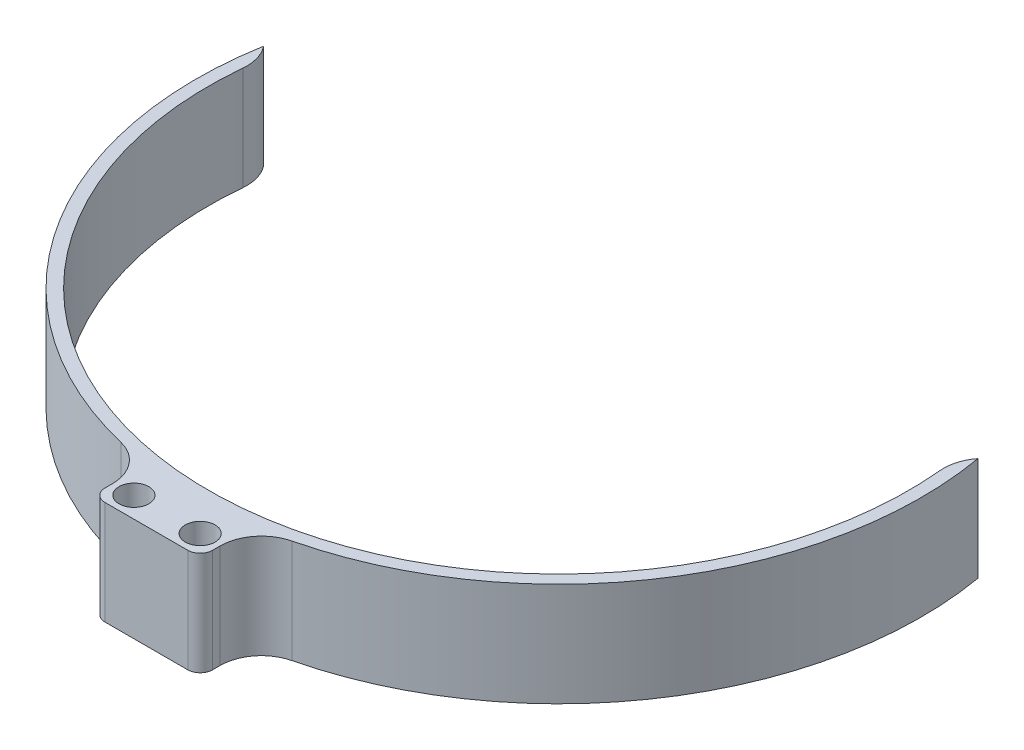
ISO-10303-21;
HEADER;
FILE_DESCRIPTION(('STEP AP214'),'2;1');
FILE_NAME('part.step','',(''),(''),'','','');
FILE_SCHEMA(('AUTOMOTIVE_DESIGN { 1 0 10303 214 1 1 1 1 }'));
ENDSEC;
DATA;
#1=APPLICATION_CONTEXT('core data for automotive mechanical design processes');
#2=APPLICATION_PROTOCOL_DEFINITION('international standard','automotive_design',2000,#1);
#3=PRODUCT_CONTEXT('',#1,'mechanical');
#4=PRODUCT('Part','Part','',(#3));
#5=PRODUCT_RELATED_PRODUCT_CATEGORY('part','',(#4));
#6=PRODUCT_DEFINITION_FORMATION('','',#4);
#7=PRODUCT_DEFINITION_CONTEXT('part definition',#1,'design');
#8=PRODUCT_DEFINITION('design','',#6,#7);
#9=PRODUCT_DEFINITION_SHAPE('','',#8);
#10=(LENGTH_UNIT() NAMED_UNIT(*) SI_UNIT(.MILLI.,.METRE.));
#11=(NAMED_UNIT(*) PLANE_ANGLE_UNIT() SI_UNIT($,.RADIAN.));
#12=(NAMED_UNIT(*) SI_UNIT($,.STERADIAN.) SOLID_ANGLE_UNIT());
#13=UNCERTAINTY_MEASURE_WITH_UNIT(LENGTH_MEASURE(1.E-05),#10,'distance_accuracy_value','');
#14=(GEOMETRIC_REPRESENTATION_CONTEXT(3) GLOBAL_UNCERTAINTY_ASSIGNED_CONTEXT((#13)) GLOBAL_UNIT_ASSIGNED_CONTEXT((#10,
#11,#12)) REPRESENTATION_CONTEXT('',''));
#15=CARTESIAN_POINT('',(0.,0.,0.));
#16=DIRECTION('',(0.,0.,1.));
#17=DIRECTION('',(1.,0.,0.));
#18=AXIS2_PLACEMENT_3D('',#15,#16,#17);
#19=CARTESIAN_POINT('',(0.,5.,0.));
#20=DIRECTION('',(0.,1.,0.));
#21=DIRECTION('',(0.,0.,1.));
#22=AXIS2_PLACEMENT_3D('',#19,#20,#21);
#23=PLANE('',#22);
#24=CARTESIAN_POINT('',(-8.,5.,94.5288969073338));
#25=DIRECTION('',(0.,1.,0.));
#26=DIRECTION('',(0.,0.,1.));
#27=AXIS2_PLACEMENT_3D('',#24,#25,#26);
#28=CIRCLE('',#27,2.3);
#29=CARTESIAN_POINT('',(-8.,5.,96.8288969073338));
#30=VERTEX_POINT('',#29);
#31=EDGE_CURVE('E241',#30,#30,#28,.T.);
#32=ORIENTED_EDGE('',*,*,#31,.F.);
#33=EDGE_LOOP('',(#32));
#34=FACE_BOUND('',#33,.T.);
#35=CARTESIAN_POINT('',(-8.,5.,94.5288969073338));
#36=DIRECTION('',(0.,1.,0.));
#37=DIRECTION('',(0.,0.,1.));
#38=AXIS2_PLACEMENT_3D('',#35,#36,#37);
#39=CIRCLE('',#38,3.6);
#40=CARTESIAN_POINT('',(-8.,5.,98.1288969073338));
#41=VERTEX_POINT('',#40);
#42=EDGE_CURVE('E255',#41,#41,#39,.F.);
#43=ORIENTED_EDGE('',*,*,#42,.F.);
#44=EDGE_LOOP('',(#43));
#45=FACE_BOUND('',#44,.T.);
#46=ADVANCED_FACE('F123',(#34,#45),#23,.T.);
#47=CARTESIAN_POINT('',(8.,5.,94.5288969073338));
#48=DIRECTION('',(0.,1.,0.));
#49=DIRECTION('',(0.,0.,1.));
#50=AXIS2_PLACEMENT_3D('',#47,#48,#49);
#51=CIRCLE('',#50,2.3);
#52=CARTESIAN_POINT('',(8.,5.,96.8288969073338));
#53=VERTEX_POINT('',#52);
#54=EDGE_CURVE('E247',#53,#53,#51,.F.);
#55=ORIENTED_EDGE('',*,*,#54,.T.);
#56=EDGE_LOOP('',(#55));
#57=FACE_BOUND('',#56,.T.);
#58=CARTESIAN_POINT('',(8.,5.,94.5288969073338));
#59=DIRECTION('',(0.,1.,0.));
#60=DIRECTION('',(0.,0.,1.));
#61=AXIS2_PLACEMENT_3D('',#58,#59,#60);
#62=CIRCLE('',#61,3.6);
#63=CARTESIAN_POINT('',(8.,5.,98.1288969073338));
#64=VERTEX_POINT('',#63);
#65=EDGE_CURVE('E244',#64,#64,#62,.F.);
#66=ORIENTED_EDGE('',*,*,#65,.F.);
#67=EDGE_LOOP('',(#66));
#68=FACE_BOUND('',#67,.T.);
#69=ADVANCED_FACE('F365',(#57,#68),#23,.T.);
#70=CARTESIAN_POINT('',(13.,5.,0.));
#71=DIRECTION('',(1.,0.,0.));
#72=DIRECTION('',(0.,0.,-1.));
#73=AXIS2_PLACEMENT_3D('',#70,#71,#72);
#74=PLANE('',#73);
#75=DIRECTION('',(0.,0.,-1.));
#76=VECTOR('',#75,1.);
#77=CARTESIAN_POINT('',(13.,25.,0.));
#78=LINE('',#77,#76);
#79=CARTESIAN_POINT('',(13.,25.,96.5288969073338));
#80=VERTEX_POINT('',#79);
#81=CARTESIAN_POINT('',(13.,25.,94.7483509091319));
#82=VERTEX_POINT('',#81);
#83=EDGE_CURVE('E298',#80,#82,#78,.T.);
#84=ORIENTED_EDGE('',*,*,#83,.F.);
#85=DIRECTION('',(0.,-1.,0.));
#86=VECTOR('',#85,1.);
#87=CARTESIAN_POINT('',(13.,0.,96.5288969073338));
#88=LINE('',#87,#86);
#89=CARTESIAN_POINT('',(13.,0.,96.5288969073338));
#90=VERTEX_POINT('',#89);
#91=EDGE_CURVE('E284',#80,#90,#88,.T.);
#92=ORIENTED_EDGE('',*,*,#91,.T.);
#93=DIRECTION('',(0.,0.,1.));
#94=VECTOR('',#93,1.);
#95=CARTESIAN_POINT('',(13.,0.,0.));
#96=LINE('',#95,#94);
#97=CARTESIAN_POINT('',(13.,0.,94.7483509091319));
#98=VERTEX_POINT('',#97);
#99=EDGE_CURVE('E318',#98,#90,#96,.T.);
#100=ORIENTED_EDGE('',*,*,#99,.F.);
#101=DIRECTION('',(0.,-1.,0.));
#102=VECTOR('',#101,1.);
#103=CARTESIAN_POINT('',(13.,5.,94.7483509091319));
#104=LINE('',#103,#102);
#105=EDGE_CURVE('E261',#98,#82,#104,.F.);
#106=ORIENTED_EDGE('',*,*,#105,.T.);
#107=EDGE_LOOP('',(#84,#92,#100,#106));
#108=FACE_BOUND('',#107,.T.);
#109=ADVANCED_FACE('F304',(#108),#74,.T.);
#110=CARTESIAN_POINT('',(0.,5.,0.));
#111=DIRECTION('',(0.,-1.,0.));
#112=DIRECTION('',(0.,0.,-1.));
#113=AXIS2_PLACEMENT_3D('',#110,#111,#112);
#114=CYLINDRICAL_SURFACE('',#113,87.5);
#115=CARTESIAN_POINT('',(0.,25.,0.));
#116=DIRECTION('',(0.,1.,0.));
#117=DIRECTION('',(0.,0.,1.));
#118=AXIS2_PLACEMENT_3D('',#115,#116,#117);
#119=CIRCLE('',#118,87.5);
#120=CARTESIAN_POINT('',(20.6410256410256,25.,85.0305713287081));
#121=VERTEX_POINT('',#120);
#122=CARTESIAN_POINT('',(86.2046982478333,25.,-15.));
#123=VERTEX_POINT('',#122);
#124=EDGE_CURVE('E309',#121,#123,#119,.T.);
#125=ORIENTED_EDGE('',*,*,#124,.F.);
#126=DIRECTION('',(0.,-1.,0.));
#127=VECTOR('',#126,1.);
#128=CARTESIAN_POINT('',(20.6410256410257,5.,85.0305713287081));
#129=LINE('',#128,#127);
#130=CARTESIAN_POINT('',(20.6410256410256,0.,85.0305713287081));
#131=VERTEX_POINT('',#130);
#132=EDGE_CURVE('E258',#121,#131,#129,.T.);
#133=ORIENTED_EDGE('',*,*,#132,.T.);
#134=CARTESIAN_POINT('',(0.,0.,0.));
#135=DIRECTION('',(0.,1.,0.));
#136=DIRECTION('',(0.,0.,1.));
#137=AXIS2_PLACEMENT_3D('',#134,#135,#136);
#138=CIRCLE('',#137,87.5);
#139=CARTESIAN_POINT('',(86.2046982478333,0.,-15.));
#140=VERTEX_POINT('',#139);
#141=EDGE_CURVE('E332',#131,#140,#138,.T.);
#142=ORIENTED_EDGE('',*,*,#141,.T.);
#143=DIRECTION('',(0.,-1.,0.));
#144=VECTOR('',#143,1.);
#145=CARTESIAN_POINT('',(86.2046982478333,5.,-15.));
#146=LINE('',#145,#144);
#147=EDGE_CURVE('E240',#123,#140,#146,.T.);
#148=ORIENTED_EDGE('',*,*,#147,.F.);
#149=EDGE_LOOP('',(#125,#133,#142,#148));
#150=FACE_BOUND('',#149,.T.);
#151=ADVANCED_FACE('F389',(#150),#114,.T.);
#152=CARTESIAN_POINT('',(0.,5.,0.));
#153=DIRECTION('',(0.,-1.,0.));
#154=DIRECTION('',(0.,0.,-1.));
#155=AXIS2_PLACEMENT_3D('',#152,#153,#154);
#156=CYLINDRICAL_SURFACE('',#155,84.5);
#157=CARTESIAN_POINT('',(0.,0.,0.));
#158=DIRECTION('',(0.,1.,0.));
#159=DIRECTION('',(0.,0.,1.));
#160=AXIS2_PLACEMENT_3D('',#157,#158,#159);
#161=CIRCLE('',#160,84.5);
#162=CARTESIAN_POINT('',(-84.129139790498,0.,-7.90808688058305));
#163=VERTEX_POINT('',#162);
#164=CARTESIAN_POINT('',(84.129139790498,0.,-7.90808688058308));
#165=VERTEX_POINT('',#164);
#166=EDGE_CURVE('E329',#163,#165,#161,.T.);
#167=ORIENTED_EDGE('',*,*,#166,.F.);
#168=DIRECTION('',(0.,-1.,0.));
#169=VECTOR('',#168,1.);
#170=CARTESIAN_POINT('',(-84.129139790498,5.,-7.90808688058305));
#171=LINE('',#170,#169);
#172=CARTESIAN_POINT('',(-84.129139790498,25.,-7.90808688058305));
#173=VERTEX_POINT('',#172);
#174=EDGE_CURVE('E274',#163,#173,#171,.F.);
#175=ORIENTED_EDGE('',*,*,#174,.T.);
#176=CARTESIAN_POINT('',(0.,25.,0.));
#177=DIRECTION('',(0.,1.,0.));
#178=DIRECTION('',(0.,0.,1.));
#179=AXIS2_PLACEMENT_3D('',#176,#177,#178);
#180=CIRCLE('',#179,84.5);
#181=CARTESIAN_POINT('',(84.129139790498,25.,-7.90808688058308));
#182=VERTEX_POINT('',#181);
#183=EDGE_CURVE('E220',#173,#182,#180,.T.);
#184=ORIENTED_EDGE('',*,*,#183,.T.);
#185=DIRECTION('',(0.,-1.,0.));
#186=VECTOR('',#185,1.);
#187=CARTESIAN_POINT('',(84.129139790498,5.,-7.90808688058308));
#188=LINE('',#187,#186);
#189=EDGE_CURVE('E271',#182,#165,#188,.T.);
#190=ORIENTED_EDGE('',*,*,#189,.T.);
#191=EDGE_LOOP('',(#167,#175,#184,#190));
#192=FACE_BOUND('',#191,.T.);
#193=ADVANCED_FACE('F388',(#192),#156,.F.);
#194=CARTESIAN_POINT('',(-86.2046982478333,0.,-15.));
#195=VERTEX_POINT('',#194);
#196=CARTESIAN_POINT('',(-20.6410256410256,0.,85.0305713287081));
#197=VERTEX_POINT('',#196);
#198=EDGE_CURVE('E326',#195,#197,#138,.T.);
#199=ORIENTED_EDGE('',*,*,#198,.T.);
#200=DIRECTION('',(0.,-1.,0.));
#201=VECTOR('',#200,1.);
#202=CARTESIAN_POINT('',(-20.6410256410257,5.,85.0305713287081));
#203=LINE('',#202,#201);
#204=CARTESIAN_POINT('',(-20.6410256410256,25.,85.0305713287081));
#205=VERTEX_POINT('',#204);
#206=EDGE_CURVE('E234',#197,#205,#203,.F.);
#207=ORIENTED_EDGE('',*,*,#206,.T.);
#208=CARTESIAN_POINT('',(0.,25.,0.));
#209=DIRECTION('',(0.,1.,0.));
#210=DIRECTION('',(0.,0.,1.));
#211=AXIS2_PLACEMENT_3D('',#208,#209,#210);
#212=CIRCLE('',#211,87.5);
#213=CARTESIAN_POINT('',(-86.2046982478333,25.,-15.));
#214=VERTEX_POINT('',#213);
#215=EDGE_CURVE('E217',#214,#205,#212,.T.);
#216=ORIENTED_EDGE('',*,*,#215,.F.);
#217=DIRECTION('',(0.,-1.,0.));
#218=VECTOR('',#217,1.);
#219=CARTESIAN_POINT('',(-86.2046982478333,5.,-15.));
#220=LINE('',#219,#218);
#221=EDGE_CURVE('E231',#214,#195,#220,.T.);
#222=ORIENTED_EDGE('',*,*,#221,.T.);
#223=EDGE_LOOP('',(#199,#207,#216,#222));
#224=FACE_BOUND('',#223,.T.);
#225=ADVANCED_FACE('F230',(#224),#114,.T.);
#226=CARTESIAN_POINT('',(-13.,5.,0.));
#227=DIRECTION('',(1.,0.,0.));
#228=DIRECTION('',(0.,0.,-1.));
#229=AXIS2_PLACEMENT_3D('',#226,#227,#228);
#230=PLANE('',#229);
#231=DIRECTION('',(0.,0.,1.));
#232=VECTOR('',#231,1.);
#233=CARTESIAN_POINT('',(-13.,0.,0.));
#234=LINE('',#233,#232);
#235=CARTESIAN_POINT('',(-13.,0.,94.7483509091319));
#236=VERTEX_POINT('',#235);
#237=CARTESIAN_POINT('',(-13.,0.,96.5288969073338));
#238=VERTEX_POINT('',#237);
#239=EDGE_CURVE('E323',#236,#238,#234,.T.);
#240=ORIENTED_EDGE('',*,*,#239,.T.);
#241=DIRECTION('',(0.,-1.,0.));
#242=VECTOR('',#241,1.);
#243=CARTESIAN_POINT('',(-13.,5.,96.5288969073338));
#244=LINE('',#243,#242);
#245=CARTESIAN_POINT('',(-13.,25.,96.5288969073338));
#246=VERTEX_POINT('',#245);
#247=EDGE_CURVE('E12',#238,#246,#244,.F.);
#248=ORIENTED_EDGE('',*,*,#247,.T.);
#249=DIRECTION('',(0.,0.,-1.));
#250=VECTOR('',#249,1.);
#251=CARTESIAN_POINT('',(-13.,25.,0.));
#252=LINE('',#251,#250);
#253=CARTESIAN_POINT('',(-13.,25.,94.7483509091319));
#254=VERTEX_POINT('',#253);
#255=EDGE_CURVE('E235',#246,#254,#252,.T.);
#256=ORIENTED_EDGE('',*,*,#255,.T.);
#257=DIRECTION('',(0.,1.,0.));
#258=VECTOR('',#257,1.);
#259=CARTESIAN_POINT('',(-13.,0.,94.7483509091319));
#260=LINE('',#259,#258);
#261=EDGE_CURVE('E264',#254,#236,#260,.F.);
#262=ORIENTED_EDGE('',*,*,#261,.T.);
#263=EDGE_LOOP('',(#240,#248,#256,#262));
#264=FACE_BOUND('',#263,.T.);
#265=ADVANCED_FACE('F380',(#264),#230,.F.);
#266=CARTESIAN_POINT('',(8.,5.,94.5288969073338));
#267=DIRECTION('',(0.,-1.,0.));
#268=DIRECTION('',(0.,0.,-1.));
#269=AXIS2_PLACEMENT_3D('',#266,#267,#268);
#270=CYLINDRICAL_SURFACE('',#269,2.3);
#271=ORIENTED_EDGE('',*,*,#54,.F.);
#272=EDGE_LOOP('',(#271));
#273=FACE_BOUND('',#272,.T.);
#274=CARTESIAN_POINT('',(8.,0.,94.5288969073338));
#275=DIRECTION('',(0.,1.,0.));
#276=DIRECTION('',(0.,0.,1.));
#277=AXIS2_PLACEMENT_3D('',#274,#275,#276);
#278=CIRCLE('',#277,2.3);
#279=CARTESIAN_POINT('',(8.,0.,96.8288969073338));
#280=VERTEX_POINT('',#279);
#281=EDGE_CURVE('E322',#280,#280,#278,.F.);
#282=ORIENTED_EDGE('',*,*,#281,.T.);
#283=EDGE_LOOP('',(#282));
#284=FACE_BOUND('',#283,.T.);
#285=ADVANCED_FACE('F377',(#273,#284),#270,.F.);
#286=CARTESIAN_POINT('',(0.,5.,99.5288969073338));
#287=DIRECTION('',(0.,0.,-1.));
#288=DIRECTION('',(-1.,0.,0.));
#289=AXIS2_PLACEMENT_3D('',#286,#287,#288);
#290=PLANE('',#289);
#291=DIRECTION('',(1.,0.,0.));
#292=VECTOR('',#291,1.);
#293=CARTESIAN_POINT('',(0.,0.,99.5288969073338));
#294=LINE('',#293,#292);
#295=CARTESIAN_POINT('',(-10.,0.,99.5288969073338));
#296=VERTEX_POINT('',#295);
#297=CARTESIAN_POINT('',(10.,0.,99.5288969073338));
#298=VERTEX_POINT('',#297);
#299=EDGE_CURVE('E317',#296,#298,#294,.T.);
#300=ORIENTED_EDGE('',*,*,#299,.T.);
#301=DIRECTION('',(0.,-1.,0.));
#302=VECTOR('',#301,1.);
#303=CARTESIAN_POINT('',(10.,25.,99.5288969073338));
#304=LINE('',#303,#302);
#305=CARTESIAN_POINT('',(10.,25.,99.5288969073338));
#306=VERTEX_POINT('',#305);
#307=EDGE_CURVE('E294',#298,#306,#304,.F.);
#308=ORIENTED_EDGE('',*,*,#307,.T.);
#309=DIRECTION('',(-1.,0.,0.));
#310=VECTOR('',#309,1.);
#311=CARTESIAN_POINT('',(0.,25.,99.5288969073338));
#312=LINE('',#311,#310);
#313=CARTESIAN_POINT('',(-10.,25.,99.5288969073338));
#314=VERTEX_POINT('',#313);
#315=EDGE_CURVE('E299',#306,#314,#312,.T.);
#316=ORIENTED_EDGE('',*,*,#315,.T.);
#317=DIRECTION('',(0.,-1.,0.));
#318=VECTOR('',#317,1.);
#319=CARTESIAN_POINT('',(-10.,5.,99.5288969073338));
#320=LINE('',#319,#318);
#321=EDGE_CURVE('E291',#314,#296,#320,.T.);
#322=ORIENTED_EDGE('',*,*,#321,.T.);
#323=EDGE_LOOP('',(#300,#308,#316,#322));
#324=FACE_BOUND('',#323,.T.);
#325=ADVANCED_FACE('F320',(#324),#290,.F.);
#326=CARTESIAN_POINT('',(-8.,5.,94.5288969073338));
#327=DIRECTION('',(0.,-1.,0.));
#328=DIRECTION('',(0.,0.,-1.));
#329=AXIS2_PLACEMENT_3D('',#326,#327,#328);
#330=CYLINDRICAL_SURFACE('',#329,2.3);
#331=ORIENTED_EDGE('',*,*,#31,.T.);
#332=EDGE_LOOP('',(#331));
#333=FACE_BOUND('',#332,.T.);
#334=CARTESIAN_POINT('',(-8.,0.,94.5288969073338));
#335=DIRECTION('',(0.,1.,0.));
#336=DIRECTION('',(0.,0.,1.));
#337=AXIS2_PLACEMENT_3D('',#334,#335,#336);
#338=CIRCLE('',#337,2.3);
#339=CARTESIAN_POINT('',(-8.,0.,96.8288969073338));
#340=VERTEX_POINT('',#339);
#341=EDGE_CURVE('E250',#340,#340,#338,.T.);
#342=ORIENTED_EDGE('',*,*,#341,.F.);
#343=EDGE_LOOP('',(#342));
#344=FACE_BOUND('',#343,.T.);
#345=ADVANCED_FACE('F360',(#333,#344),#330,.F.);
#346=CARTESIAN_POINT('',(0.,0.,0.));
#347=DIRECTION('',(0.,1.,0.));
#348=DIRECTION('',(0.,0.,1.));
#349=AXIS2_PLACEMENT_3D('',#346,#347,#348);
#350=PLANE('',#349);
#351=ORIENTED_EDGE('',*,*,#99,.T.);
#352=CARTESIAN_POINT('',(10.,0.,96.5288969073338));
#353=DIRECTION('',(0.,1.,0.));
#354=DIRECTION('',(0.,0.,1.));
#355=AXIS2_PLACEMENT_3D('',#352,#353,#354);
#356=CIRCLE('',#355,3.);
#357=EDGE_CURVE('E289',#90,#298,#356,.F.);
#358=ORIENTED_EDGE('',*,*,#357,.T.);
#359=ORIENTED_EDGE('',*,*,#299,.F.);
#360=CARTESIAN_POINT('',(-10.,0.,96.5288969073338));
#361=DIRECTION('',(0.,1.,0.));
#362=DIRECTION('',(0.,0.,1.));
#363=AXIS2_PLACEMENT_3D('',#360,#361,#362);
#364=CIRCLE('',#363,3.);
#365=EDGE_CURVE('E287',#296,#238,#364,.F.);
#366=ORIENTED_EDGE('',*,*,#365,.T.);
#367=ORIENTED_EDGE('',*,*,#239,.F.);
#368=CARTESIAN_POINT('',(-23.,0.,94.7483509091319));
#369=DIRECTION('',(0.,1.,0.));
#370=DIRECTION('',(0.,0.,1.));
#371=AXIS2_PLACEMENT_3D('',#368,#369,#370);
#372=CIRCLE('',#371,10.);
#373=EDGE_CURVE('E280',#236,#197,#372,.T.);
#374=ORIENTED_EDGE('',*,*,#373,.T.);
#375=ORIENTED_EDGE('',*,*,#198,.F.);
#376=CARTESIAN_POINT('',(-94.0852510083084,0.,-8.84395515047453));
#377=DIRECTION('',(0.,1.,0.));
#378=DIRECTION('',(0.,0.,1.));
#379=AXIS2_PLACEMENT_3D('',#376,#377,#378);
#380=CIRCLE('',#379,10.);
#381=EDGE_CURVE('E239',#195,#163,#380,.F.);
#382=ORIENTED_EDGE('',*,*,#381,.T.);
#383=ORIENTED_EDGE('',*,*,#166,.T.);
#384=CARTESIAN_POINT('',(94.0852510083084,0.,-8.84395515047457));
#385=DIRECTION('',(0.,1.,0.));
#386=DIRECTION('',(0.,0.,1.));
#387=AXIS2_PLACEMENT_3D('',#384,#385,#386);
#388=CIRCLE('',#387,10.);
#389=EDGE_CURVE('E268',#165,#140,#388,.F.);
#390=ORIENTED_EDGE('',*,*,#389,.T.);
#391=ORIENTED_EDGE('',*,*,#141,.F.);
#392=CARTESIAN_POINT('',(23.,0.,94.7483509091319));
#393=DIRECTION('',(0.,1.,0.));
#394=DIRECTION('',(0.,0.,1.));
#395=AXIS2_PLACEMENT_3D('',#392,#393,#394);
#396=CIRCLE('',#395,10.);
#397=EDGE_CURVE('E224',#131,#98,#396,.T.);
#398=ORIENTED_EDGE('',*,*,#397,.T.);
#399=EDGE_LOOP('',(#351,#358,#359,#366,#367,#374,#375,#382,#383,#390,#391,#398));
#400=FACE_BOUND('',#399,.T.);
#401=ORIENTED_EDGE('',*,*,#281,.F.);
#402=EDGE_LOOP('',(#401));
#403=FACE_BOUND('',#402,.T.);
#404=ORIENTED_EDGE('',*,*,#341,.T.);
#405=EDGE_LOOP('',(#404));
#406=FACE_BOUND('',#405,.T.);
#407=ADVANCED_FACE('F315',(#400,#403,#406),#350,.F.);
#408=CARTESIAN_POINT('',(0.,25.,0.));
#409=DIRECTION('',(0.,1.,0.));
#410=DIRECTION('',(0.,0.,1.));
#411=AXIS2_PLACEMENT_3D('',#408,#409,#410);
#412=PLANE('',#411);
#413=CARTESIAN_POINT('',(-8.,25.,94.5288969073338));
#414=DIRECTION('',(0.,1.,0.));
#415=DIRECTION('',(0.,0.,1.));
#416=AXIS2_PLACEMENT_3D('',#413,#414,#415);
#417=CIRCLE('',#416,3.6);
#418=CARTESIAN_POINT('',(-8.,25.,98.1288969073338));
#419=VERTEX_POINT('',#418);
#420=EDGE_CURVE('E236',#419,#419,#417,.T.);
#421=ORIENTED_EDGE('',*,*,#420,.F.);
#422=EDGE_LOOP('',(#421));
#423=FACE_BOUND('',#422,.T.);
#424=ORIENTED_EDGE('',*,*,#315,.F.);
#425=CARTESIAN_POINT('',(10.,25.,96.5288969073338));
#426=DIRECTION('',(0.,1.,0.));
#427=DIRECTION('',(0.,0.,1.));
#428=AXIS2_PLACEMENT_3D('',#425,#426,#427);
#429=CIRCLE('',#428,3.);
#430=EDGE_CURVE('E131',#306,#80,#429,.T.);
#431=ORIENTED_EDGE('',*,*,#430,.T.);
#432=ORIENTED_EDGE('',*,*,#83,.T.);
#433=CARTESIAN_POINT('',(23.,25.,94.7483509091319));
#434=DIRECTION('',(0.,1.,0.));
#435=DIRECTION('',(0.,0.,1.));
#436=AXIS2_PLACEMENT_3D('',#433,#434,#435);
#437=CIRCLE('',#436,10.);
#438=EDGE_CURVE('E278',#82,#121,#437,.F.);
#439=ORIENTED_EDGE('',*,*,#438,.T.);
#440=ORIENTED_EDGE('',*,*,#124,.T.);
#441=CARTESIAN_POINT('',(94.0852510083084,25.,-8.84395515047457));
#442=DIRECTION('',(0.,1.,0.));
#443=DIRECTION('',(0.,0.,1.));
#444=AXIS2_PLACEMENT_3D('',#441,#442,#443);
#445=CIRCLE('',#444,10.);
#446=EDGE_CURVE('E225',#123,#182,#445,.T.);
#447=ORIENTED_EDGE('',*,*,#446,.T.);
#448=ORIENTED_EDGE('',*,*,#183,.F.);
#449=CARTESIAN_POINT('',(-94.0852510083084,25.,-8.84395515047453));
#450=DIRECTION('',(0.,1.,0.));
#451=DIRECTION('',(0.,0.,1.));
#452=AXIS2_PLACEMENT_3D('',#449,#450,#451);
#453=CIRCLE('',#452,10.);
#454=EDGE_CURVE('E212',#173,#214,#453,.T.);
#455=ORIENTED_EDGE('',*,*,#454,.T.);
#456=ORIENTED_EDGE('',*,*,#215,.T.);
#457=CARTESIAN_POINT('',(-23.,25.,94.7483509091319));
#458=DIRECTION('',(0.,1.,0.));
#459=DIRECTION('',(0.,0.,1.));
#460=AXIS2_PLACEMENT_3D('',#457,#458,#459);
#461=CIRCLE('',#460,10.);
#462=EDGE_CURVE('E282',#205,#254,#461,.F.);
#463=ORIENTED_EDGE('',*,*,#462,.T.);
#464=ORIENTED_EDGE('',*,*,#255,.F.);
#465=CARTESIAN_POINT('',(-10.,25.,96.5288969073338));
#466=DIRECTION('',(0.,1.,0.));
#467=DIRECTION('',(0.,0.,1.));
#468=AXIS2_PLACEMENT_3D('',#465,#466,#467);
#469=CIRCLE('',#468,3.);
#470=EDGE_CURVE('E143',#246,#314,#469,.T.);
#471=ORIENTED_EDGE('',*,*,#470,.T.);
#472=EDGE_LOOP('',(#424,#431,#432,#439,#440,#447,#448,#455,#456,#463,#464,#471));
#473=FACE_BOUND('',#472,.T.);
#474=CARTESIAN_POINT('',(8.,25.,94.5288969073338));
#475=DIRECTION('',(0.,1.,0.));
#476=DIRECTION('',(0.,0.,1.));
#477=AXIS2_PLACEMENT_3D('',#474,#475,#476);
#478=CIRCLE('',#477,3.6);
#479=CARTESIAN_POINT('',(8.,25.,98.1288969073338));
#480=VERTEX_POINT('',#479);
#481=EDGE_CURVE('E344',#480,#480,#478,.T.);
#482=ORIENTED_EDGE('',*,*,#481,.F.);
#483=EDGE_LOOP('',(#482));
#484=FACE_BOUND('',#483,.T.);
#485=ADVANCED_FACE('F214',(#423,#473,#484),#412,.T.);
#486=CARTESIAN_POINT('',(-8.,25.,94.5288969073338));
#487=DIRECTION('',(0.,-1.,0.));
#488=DIRECTION('',(0.,0.,-1.));
#489=AXIS2_PLACEMENT_3D('',#486,#487,#488);
#490=CYLINDRICAL_SURFACE('',#489,3.6);
#491=ORIENTED_EDGE('',*,*,#420,.T.);
#492=EDGE_LOOP('',(#491));
#493=FACE_BOUND('',#492,.T.);
#494=ORIENTED_EDGE('',*,*,#42,.T.);
#495=EDGE_LOOP('',(#494));
#496=FACE_BOUND('',#495,.T.);
#497=ADVANCED_FACE('F351',(#493,#496),#490,.F.);
#498=CARTESIAN_POINT('',(8.,25.,94.5288969073338));
#499=DIRECTION('',(0.,-1.,0.));
#500=DIRECTION('',(0.,0.,-1.));
#501=AXIS2_PLACEMENT_3D('',#498,#499,#500);
#502=CYLINDRICAL_SURFACE('',#501,3.6);
#503=ORIENTED_EDGE('',*,*,#481,.T.);
#504=EDGE_LOOP('',(#503));
#505=FACE_BOUND('',#504,.T.);
#506=ORIENTED_EDGE('',*,*,#65,.T.);
#507=EDGE_LOOP('',(#506));
#508=FACE_BOUND('',#507,.T.);
#509=ADVANCED_FACE('F348',(#505,#508),#502,.F.);
#510=CARTESIAN_POINT('',(23.,5.,94.7483509091319));
#511=DIRECTION('',(0.,-1.,0.));
#512=DIRECTION('',(0.,0.,-1.));
#513=AXIS2_PLACEMENT_3D('',#510,#511,#512);
#514=CYLINDRICAL_SURFACE('',#513,10.);
#515=ORIENTED_EDGE('',*,*,#438,.F.);
#516=ORIENTED_EDGE('',*,*,#105,.F.);
#517=ORIENTED_EDGE('',*,*,#397,.F.);
#518=ORIENTED_EDGE('',*,*,#132,.F.);
#519=EDGE_LOOP('',(#515,#516,#517,#518));
#520=FACE_BOUND('',#519,.T.);
#521=ADVANCED_FACE('F395',(#520),#514,.F.);
#522=CARTESIAN_POINT('',(-23.,5.,94.7483509091319));
#523=DIRECTION('',(0.,-1.,0.));
#524=DIRECTION('',(0.,0.,-1.));
#525=AXIS2_PLACEMENT_3D('',#522,#523,#524);
#526=CYLINDRICAL_SURFACE('',#525,10.);
#527=ORIENTED_EDGE('',*,*,#462,.F.);
#528=ORIENTED_EDGE('',*,*,#206,.F.);
#529=ORIENTED_EDGE('',*,*,#373,.F.);
#530=ORIENTED_EDGE('',*,*,#261,.F.);
#531=EDGE_LOOP('',(#527,#528,#529,#530));
#532=FACE_BOUND('',#531,.T.);
#533=ADVANCED_FACE('F398',(#532),#526,.F.);
#534=CARTESIAN_POINT('',(-94.0852510083084,5.,-8.84395515047453));
#535=DIRECTION('',(0.,-1.,0.));
#536=DIRECTION('',(0.,0.,-1.));
#537=AXIS2_PLACEMENT_3D('',#534,#535,#536);
#538=CYLINDRICAL_SURFACE('',#537,10.);
#539=ORIENTED_EDGE('',*,*,#454,.F.);
#540=ORIENTED_EDGE('',*,*,#174,.F.);
#541=ORIENTED_EDGE('',*,*,#381,.F.);
#542=ORIENTED_EDGE('',*,*,#221,.F.);
#543=EDGE_LOOP('',(#539,#540,#541,#542));
#544=FACE_BOUND('',#543,.T.);
#545=ADVANCED_FACE('F238',(#544),#538,.T.);
#546=CARTESIAN_POINT('',(94.0852510083084,5.,-8.84395515047457));
#547=DIRECTION('',(0.,-1.,0.));
#548=DIRECTION('',(0.,0.,-1.));
#549=AXIS2_PLACEMENT_3D('',#546,#547,#548);
#550=CYLINDRICAL_SURFACE('',#549,10.);
#551=ORIENTED_EDGE('',*,*,#446,.F.);
#552=ORIENTED_EDGE('',*,*,#147,.T.);
#553=ORIENTED_EDGE('',*,*,#389,.F.);
#554=ORIENTED_EDGE('',*,*,#189,.F.);
#555=EDGE_LOOP('',(#551,#552,#553,#554));
#556=FACE_BOUND('',#555,.T.);
#557=ADVANCED_FACE('F405',(#556),#550,.T.);
#558=CARTESIAN_POINT('',(10.,5.,96.5288969073338));
#559=DIRECTION('',(0.,1.,0.));
#560=DIRECTION('',(0.,0.,1.));
#561=AXIS2_PLACEMENT_3D('',#558,#559,#560);
#562=CYLINDRICAL_SURFACE('',#561,3.);
#563=ORIENTED_EDGE('',*,*,#430,.F.);
#564=ORIENTED_EDGE('',*,*,#307,.F.);
#565=ORIENTED_EDGE('',*,*,#357,.F.);
#566=ORIENTED_EDGE('',*,*,#91,.F.);
#567=EDGE_LOOP('',(#563,#564,#565,#566));
#568=FACE_BOUND('',#567,.T.);
#569=ADVANCED_FACE('F311',(#568),#562,.T.);
#570=CARTESIAN_POINT('',(-10.,5.,96.5288969073338));
#571=DIRECTION('',(0.,-1.,0.));
#572=DIRECTION('',(0.,0.,-1.));
#573=AXIS2_PLACEMENT_3D('',#570,#571,#572);
#574=CYLINDRICAL_SURFACE('',#573,3.);
#575=ORIENTED_EDGE('',*,*,#470,.F.);
#576=ORIENTED_EDGE('',*,*,#247,.F.);
#577=ORIENTED_EDGE('',*,*,#365,.F.);
#578=ORIENTED_EDGE('',*,*,#321,.F.);
#579=EDGE_LOOP('',(#575,#576,#577,#578));
#580=FACE_BOUND('',#579,.T.);
#581=ADVANCED_FACE('F125',(#580),#574,.T.);
#582=CLOSED_SHELL('',(#46,#69,#109,#151,#193,#225,#265,#285,#325,#345,#407,#485,#497,#509,#521,
#533,#545,#557,#569,#581));
#583=MANIFOLD_SOLID_BREP('B2',#582);
#584=ADVANCED_BREP_SHAPE_REPRESENTATION('',(#18,#583),#14);
#585=SHAPE_DEFINITION_REPRESENTATION(#9,#584);
ENDSEC;
END-ISO-10303-21;
